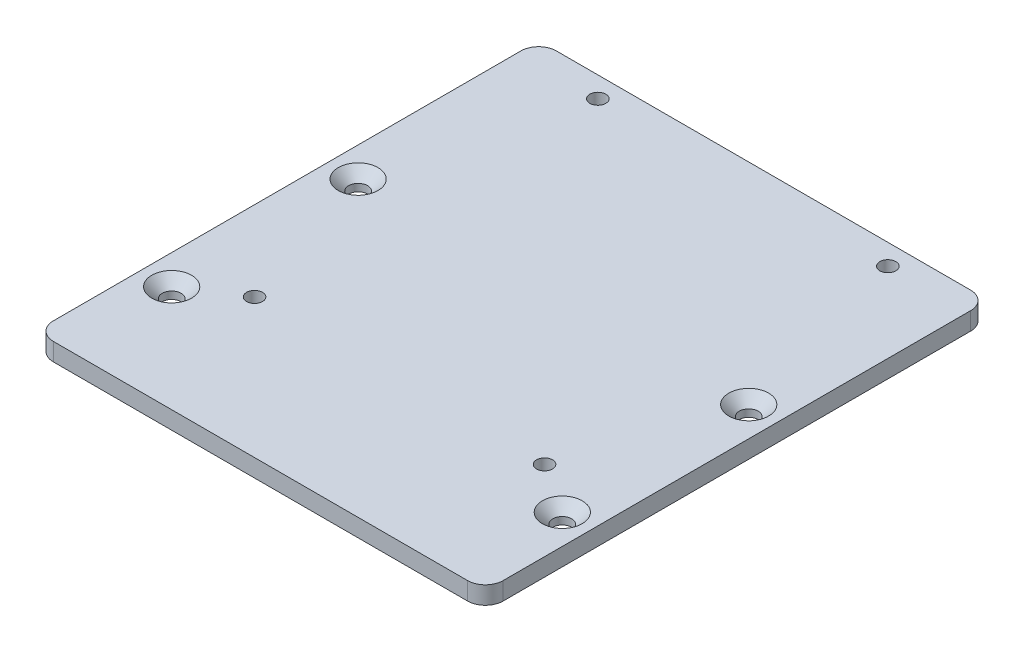
ISO-10303-21;
HEADER;
FILE_DESCRIPTION(('STEP AP214'),'2;1');
FILE_NAME('part.step','',(''),(''),'','','');
FILE_SCHEMA(('AUTOMOTIVE_DESIGN { 1 0 10303 214 1 1 1 1 }'));
ENDSEC;
DATA;
#1=APPLICATION_CONTEXT('core data for automotive mechanical design processes');
#2=APPLICATION_PROTOCOL_DEFINITION('international standard','automotive_design',2000,#1);
#3=PRODUCT_CONTEXT('',#1,'mechanical');
#4=PRODUCT('Part','Part','',(#3));
#5=PRODUCT_RELATED_PRODUCT_CATEGORY('part','',(#4));
#6=PRODUCT_DEFINITION_FORMATION('','',#4);
#7=PRODUCT_DEFINITION_CONTEXT('part definition',#1,'design');
#8=PRODUCT_DEFINITION('design','',#6,#7);
#9=PRODUCT_DEFINITION_SHAPE('','',#8);
#10=(LENGTH_UNIT() NAMED_UNIT(*) SI_UNIT(.MILLI.,.METRE.));
#11=(NAMED_UNIT(*) PLANE_ANGLE_UNIT() SI_UNIT($,.RADIAN.));
#12=(NAMED_UNIT(*) SI_UNIT($,.STERADIAN.) SOLID_ANGLE_UNIT());
#13=UNCERTAINTY_MEASURE_WITH_UNIT(LENGTH_MEASURE(1.E-05),#10,'distance_accuracy_value','');
#14=(GEOMETRIC_REPRESENTATION_CONTEXT(3) GLOBAL_UNCERTAINTY_ASSIGNED_CONTEXT((#13)) GLOBAL_UNIT_ASSIGNED_CONTEXT((#10,
#11,#12)) REPRESENTATION_CONTEXT('',''));
#15=CARTESIAN_POINT('',(0.,0.,0.));
#16=DIRECTION('',(0.,0.,1.));
#17=DIRECTION('',(1.,0.,0.));
#18=AXIS2_PLACEMENT_3D('',#15,#16,#17);
#19=CARTESIAN_POINT('',(-38.,3.,42.5));
#20=DIRECTION('',(1.,0.,0.));
#21=DIRECTION('',(0.,0.,-1.));
#22=AXIS2_PLACEMENT_3D('',#19,#20,#21);
#23=PLANE('',#22);
#24=DIRECTION('',(0.,0.,1.));
#25=VECTOR('',#24,1.);
#26=CARTESIAN_POINT('',(-38.,3.,42.5));
#27=LINE('',#26,#25);
#28=CARTESIAN_POINT('',(-38.,3.,-39.5));
#29=VERTEX_POINT('',#28);
#30=CARTESIAN_POINT('',(-38.,3.,39.5));
#31=VERTEX_POINT('',#30);
#32=EDGE_CURVE('E128',#29,#31,#27,.T.);
#33=ORIENTED_EDGE('',*,*,#32,.F.);
#34=DIRECTION('',(0.,-1.,0.));
#35=VECTOR('',#34,1.);
#36=CARTESIAN_POINT('',(-38.,3.,-39.5));
#37=LINE('',#36,#35);
#38=CARTESIAN_POINT('',(-38.,0.,-39.5));
#39=VERTEX_POINT('',#38);
#40=EDGE_CURVE('E112',#29,#39,#37,.T.);
#41=ORIENTED_EDGE('',*,*,#40,.T.);
#42=DIRECTION('',(0.,0.,1.));
#43=VECTOR('',#42,1.);
#44=CARTESIAN_POINT('',(-38.,0.,42.5));
#45=LINE('',#44,#43);
#46=CARTESIAN_POINT('',(-38.,0.,39.5));
#47=VERTEX_POINT('',#46);
#48=EDGE_CURVE('E125',#39,#47,#45,.T.);
#49=ORIENTED_EDGE('',*,*,#48,.T.);
#50=DIRECTION('',(0.,-1.,0.));
#51=VECTOR('',#50,1.);
#52=CARTESIAN_POINT('',(-38.,3.,39.5));
#53=LINE('',#52,#51);
#54=EDGE_CURVE('E130',#47,#31,#53,.F.);
#55=ORIENTED_EDGE('',*,*,#54,.T.);
#56=EDGE_LOOP('',(#33,#41,#49,#55));
#57=FACE_BOUND('',#56,.T.);
#58=ADVANCED_FACE('F42',(#57),#23,.F.);
#59=CARTESIAN_POINT('',(38.,3.,42.5));
#60=DIRECTION('',(0.,0.,-1.));
#61=DIRECTION('',(-1.,0.,0.));
#62=AXIS2_PLACEMENT_3D('',#59,#60,#61);
#63=PLANE('',#62);
#64=DIRECTION('',(1.,0.,0.));
#65=VECTOR('',#64,1.);
#66=CARTESIAN_POINT('',(38.,0.,42.5));
#67=LINE('',#66,#65);
#68=CARTESIAN_POINT('',(-35.,0.,42.5));
#69=VERTEX_POINT('',#68);
#70=CARTESIAN_POINT('',(35.,0.,42.5));
#71=VERTEX_POINT('',#70);
#72=EDGE_CURVE('E135',#69,#71,#67,.T.);
#73=ORIENTED_EDGE('',*,*,#72,.T.);
#74=DIRECTION('',(0.,-1.,0.));
#75=VECTOR('',#74,1.);
#76=CARTESIAN_POINT('',(35.,3.,42.5));
#77=LINE('',#76,#75);
#78=CARTESIAN_POINT('',(35.,3.,42.5));
#79=VERTEX_POINT('',#78);
#80=EDGE_CURVE('E12',#71,#79,#77,.F.);
#81=ORIENTED_EDGE('',*,*,#80,.T.);
#82=DIRECTION('',(1.,0.,0.));
#83=VECTOR('',#82,1.);
#84=CARTESIAN_POINT('',(38.,3.,42.5));
#85=LINE('',#84,#83);
#86=CARTESIAN_POINT('',(-35.,3.,42.5));
#87=VERTEX_POINT('',#86);
#88=EDGE_CURVE('E188',#87,#79,#85,.T.);
#89=ORIENTED_EDGE('',*,*,#88,.F.);
#90=DIRECTION('',(0.,-1.,0.));
#91=VECTOR('',#90,1.);
#92=CARTESIAN_POINT('',(-35.,3.,42.5));
#93=LINE('',#92,#91);
#94=EDGE_CURVE('E50',#87,#69,#93,.T.);
#95=ORIENTED_EDGE('',*,*,#94,.T.);
#96=EDGE_LOOP('',(#73,#81,#89,#95));
#97=FACE_BOUND('',#96,.T.);
#98=ADVANCED_FACE('F186',(#97),#63,.F.);
#99=CARTESIAN_POINT('',(38.,3.,42.5));
#100=DIRECTION('',(-1.,0.,0.));
#101=DIRECTION('',(0.,0.,1.));
#102=AXIS2_PLACEMENT_3D('',#99,#100,#101);
#103=PLANE('',#102);
#104=DIRECTION('',(0.,0.,-1.));
#105=VECTOR('',#104,1.);
#106=CARTESIAN_POINT('',(38.,0.,42.5));
#107=LINE('',#106,#105);
#108=CARTESIAN_POINT('',(38.,0.,39.5));
#109=VERTEX_POINT('',#108);
#110=CARTESIAN_POINT('',(38.,0.,-39.5));
#111=VERTEX_POINT('',#110);
#112=EDGE_CURVE('E141',#109,#111,#107,.T.);
#113=ORIENTED_EDGE('',*,*,#112,.T.);
#114=DIRECTION('',(0.,-1.,0.));
#115=VECTOR('',#114,1.);
#116=CARTESIAN_POINT('',(38.,3.,-39.5));
#117=LINE('',#116,#115);
#118=CARTESIAN_POINT('',(38.,3.,-39.5));
#119=VERTEX_POINT('',#118);
#120=EDGE_CURVE('E57',#111,#119,#117,.F.);
#121=ORIENTED_EDGE('',*,*,#120,.T.);
#122=DIRECTION('',(0.,0.,-1.));
#123=VECTOR('',#122,1.);
#124=CARTESIAN_POINT('',(38.,3.,42.5));
#125=LINE('',#124,#123);
#126=CARTESIAN_POINT('',(38.,3.,39.5));
#127=VERTEX_POINT('',#126);
#128=EDGE_CURVE('E196',#127,#119,#125,.T.);
#129=ORIENTED_EDGE('',*,*,#128,.F.);
#130=DIRECTION('',(0.,-1.,0.));
#131=VECTOR('',#130,1.);
#132=CARTESIAN_POINT('',(38.,3.,39.5));
#133=LINE('',#132,#131);
#134=EDGE_CURVE('E179',#127,#109,#133,.T.);
#135=ORIENTED_EDGE('',*,*,#134,.T.);
#136=EDGE_LOOP('',(#113,#121,#129,#135));
#137=FACE_BOUND('',#136,.T.);
#138=ADVANCED_FACE('F195',(#137),#103,.F.);
#139=CARTESIAN_POINT('',(38.,3.,-42.5));
#140=DIRECTION('',(0.,0.,1.));
#141=DIRECTION('',(1.,0.,0.));
#142=AXIS2_PLACEMENT_3D('',#139,#140,#141);
#143=PLANE('',#142);
#144=DIRECTION('',(-1.,0.,0.));
#145=VECTOR('',#144,1.);
#146=CARTESIAN_POINT('',(38.,0.,-42.5));
#147=LINE('',#146,#145);
#148=CARTESIAN_POINT('',(35.,0.,-42.5));
#149=VERTEX_POINT('',#148);
#150=CARTESIAN_POINT('',(-35.,0.,-42.5));
#151=VERTEX_POINT('',#150);
#152=EDGE_CURVE('E156',#149,#151,#147,.T.);
#153=ORIENTED_EDGE('',*,*,#152,.T.);
#154=DIRECTION('',(0.,-1.,0.));
#155=VECTOR('',#154,1.);
#156=CARTESIAN_POINT('',(-35.,3.,-42.5));
#157=LINE('',#156,#155);
#158=CARTESIAN_POINT('',(-35.,3.,-42.5));
#159=VERTEX_POINT('',#158);
#160=EDGE_CURVE('E113',#151,#159,#157,.F.);
#161=ORIENTED_EDGE('',*,*,#160,.T.);
#162=DIRECTION('',(-1.,0.,0.));
#163=VECTOR('',#162,1.);
#164=CARTESIAN_POINT('',(38.,3.,-42.5));
#165=LINE('',#164,#163);
#166=CARTESIAN_POINT('',(35.,3.,-42.5));
#167=VERTEX_POINT('',#166);
#168=EDGE_CURVE('E147',#167,#159,#165,.T.);
#169=ORIENTED_EDGE('',*,*,#168,.F.);
#170=DIRECTION('',(0.,-1.,0.));
#171=VECTOR('',#170,1.);
#172=CARTESIAN_POINT('',(35.,3.,-42.5));
#173=LINE('',#172,#171);
#174=EDGE_CURVE('E119',#167,#149,#173,.T.);
#175=ORIENTED_EDGE('',*,*,#174,.T.);
#176=EDGE_LOOP('',(#153,#161,#169,#175));
#177=FACE_BOUND('',#176,.T.);
#178=ADVANCED_FACE('F297',(#177),#143,.F.);
#179=CARTESIAN_POINT('',(0.,3.,0.));
#180=DIRECTION('',(0.,1.,0.));
#181=DIRECTION('',(0.,0.,1.));
#182=AXIS2_PLACEMENT_3D('',#179,#180,#181);
#183=PLANE('',#182);
#184=CARTESIAN_POINT('',(-33.,3.,24.5));
#185=DIRECTION('',(0.,1.,0.));
#186=DIRECTION('',(0.,0.,1.));
#187=AXIS2_PLACEMENT_3D('',#184,#185,#186);
#188=CIRCLE('',#187,3.36);
#189=CARTESIAN_POINT('',(-33.,3.,27.86));
#190=VERTEX_POINT('',#189);
#191=EDGE_CURVE('E535',#190,#190,#188,.T.);
#192=ORIENTED_EDGE('',*,*,#191,.F.);
#193=EDGE_LOOP('',(#192));
#194=FACE_BOUND('',#193,.T.);
#195=CARTESIAN_POINT('',(-33.,3.,-7.));
#196=DIRECTION('',(0.,1.,0.));
#197=DIRECTION('',(0.,0.,1.));
#198=AXIS2_PLACEMENT_3D('',#195,#196,#197);
#199=CIRCLE('',#198,3.36);
#200=CARTESIAN_POINT('',(-33.,3.,-3.64));
#201=VERTEX_POINT('',#200);
#202=EDGE_CURVE('E544',#201,#201,#199,.T.);
#203=ORIENTED_EDGE('',*,*,#202,.F.);
#204=EDGE_LOOP('',(#203));
#205=FACE_BOUND('',#204,.T.);
#206=CARTESIAN_POINT('',(33.,3.,-7.00000000000001));
#207=DIRECTION('',(0.,1.,0.));
#208=DIRECTION('',(0.,0.,1.));
#209=AXIS2_PLACEMENT_3D('',#206,#207,#208);
#210=CIRCLE('',#209,3.36);
#211=CARTESIAN_POINT('',(33.,3.,-3.64000000000001));
#212=VERTEX_POINT('',#211);
#213=EDGE_CURVE('E553',#212,#212,#210,.T.);
#214=ORIENTED_EDGE('',*,*,#213,.F.);
#215=EDGE_LOOP('',(#214));
#216=FACE_BOUND('',#215,.T.);
#217=CARTESIAN_POINT('',(33.,3.,24.5));
#218=DIRECTION('',(0.,1.,0.));
#219=DIRECTION('',(0.,0.,1.));
#220=AXIS2_PLACEMENT_3D('',#217,#218,#219);
#221=CIRCLE('',#220,3.36);
#222=CARTESIAN_POINT('',(33.,3.,27.86));
#223=VERTEX_POINT('',#222);
#224=EDGE_CURVE('E248',#223,#223,#221,.T.);
#225=ORIENTED_EDGE('',*,*,#224,.F.);
#226=EDGE_LOOP('',(#225));
#227=FACE_BOUND('',#226,.T.);
#228=CARTESIAN_POINT('',(-24.5,3.,-39.));
#229=DIRECTION('',(0.,1.,0.));
#230=DIRECTION('',(0.,0.,1.));
#231=AXIS2_PLACEMENT_3D('',#228,#229,#230);
#232=CIRCLE('',#231,1.35);
#233=CARTESIAN_POINT('',(-24.5,3.,-37.65));
#234=VERTEX_POINT('',#233);
#235=EDGE_CURVE('E228',#234,#234,#232,.T.);
#236=ORIENTED_EDGE('',*,*,#235,.F.);
#237=EDGE_LOOP('',(#236));
#238=FACE_BOUND('',#237,.T.);
#239=CARTESIAN_POINT('',(-24.5,3.,19.));
#240=DIRECTION('',(0.,1.,0.));
#241=DIRECTION('',(0.,0.,1.));
#242=AXIS2_PLACEMENT_3D('',#239,#240,#241);
#243=CIRCLE('',#242,1.35);
#244=CARTESIAN_POINT('',(-24.5,3.,20.35));
#245=VERTEX_POINT('',#244);
#246=EDGE_CURVE('E221',#245,#245,#243,.T.);
#247=ORIENTED_EDGE('',*,*,#246,.F.);
#248=EDGE_LOOP('',(#247));
#249=FACE_BOUND('',#248,.T.);
#250=CARTESIAN_POINT('',(24.5,3.,19.));
#251=DIRECTION('',(0.,1.,0.));
#252=DIRECTION('',(0.,0.,1.));
#253=AXIS2_PLACEMENT_3D('',#250,#251,#252);
#254=CIRCLE('',#253,1.35);
#255=CARTESIAN_POINT('',(24.5,3.,20.35));
#256=VERTEX_POINT('',#255);
#257=EDGE_CURVE('E210',#256,#256,#254,.T.);
#258=ORIENTED_EDGE('',*,*,#257,.F.);
#259=EDGE_LOOP('',(#258));
#260=FACE_BOUND('',#259,.T.);
#261=CARTESIAN_POINT('',(24.5,3.,-39.));
#262=DIRECTION('',(0.,1.,0.));
#263=DIRECTION('',(0.,0.,1.));
#264=AXIS2_PLACEMENT_3D('',#261,#262,#263);
#265=CIRCLE('',#264,1.35);
#266=CARTESIAN_POINT('',(24.5,3.,-37.65));
#267=VERTEX_POINT('',#266);
#268=EDGE_CURVE('E143',#267,#267,#265,.T.);
#269=ORIENTED_EDGE('',*,*,#268,.F.);
#270=EDGE_LOOP('',(#269));
#271=FACE_BOUND('',#270,.T.);
#272=ORIENTED_EDGE('',*,*,#168,.T.);
#273=CARTESIAN_POINT('',(-35.,3.,-39.5));
#274=DIRECTION('',(0.,1.,0.));
#275=DIRECTION('',(0.,0.,1.));
#276=AXIS2_PLACEMENT_3D('',#273,#274,#275);
#277=CIRCLE('',#276,3.);
#278=EDGE_CURVE('E177',#159,#29,#277,.T.);
#279=ORIENTED_EDGE('',*,*,#278,.T.);
#280=ORIENTED_EDGE('',*,*,#32,.T.);
#281=CARTESIAN_POINT('',(-35.,3.,39.5));
#282=DIRECTION('',(0.,1.,0.));
#283=DIRECTION('',(0.,0.,1.));
#284=AXIS2_PLACEMENT_3D('',#281,#282,#283);
#285=CIRCLE('',#284,3.);
#286=EDGE_CURVE('E172',#31,#87,#285,.T.);
#287=ORIENTED_EDGE('',*,*,#286,.T.);
#288=ORIENTED_EDGE('',*,*,#88,.T.);
#289=CARTESIAN_POINT('',(35.,3.,39.5));
#290=DIRECTION('',(0.,1.,0.));
#291=DIRECTION('',(0.,0.,1.));
#292=AXIS2_PLACEMENT_3D('',#289,#290,#291);
#293=CIRCLE('',#292,3.);
#294=EDGE_CURVE('E64',#79,#127,#293,.T.);
#295=ORIENTED_EDGE('',*,*,#294,.T.);
#296=ORIENTED_EDGE('',*,*,#128,.T.);
#297=CARTESIAN_POINT('',(35.,3.,-39.5));
#298=DIRECTION('',(0.,1.,0.));
#299=DIRECTION('',(0.,0.,1.));
#300=AXIS2_PLACEMENT_3D('',#297,#298,#299);
#301=CIRCLE('',#300,3.);
#302=EDGE_CURVE('E175',#119,#167,#301,.T.);
#303=ORIENTED_EDGE('',*,*,#302,.T.);
#304=EDGE_LOOP('',(#272,#279,#280,#287,#288,#295,#296,#303));
#305=FACE_BOUND('',#304,.T.);
#306=ADVANCED_FACE('F293',(#194,#205,#216,#227,#238,#249,#260,#271,#305),#183,.T.);
#307=CARTESIAN_POINT('',(0.,0.,0.));
#308=DIRECTION('',(0.,1.,0.));
#309=DIRECTION('',(0.,0.,1.));
#310=AXIS2_PLACEMENT_3D('',#307,#308,#309);
#311=PLANE('',#310);
#312=CARTESIAN_POINT('',(-33.,0.,24.5));
#313=DIRECTION('',(0.,1.,0.));
#314=DIRECTION('',(0.,0.,1.));
#315=AXIS2_PLACEMENT_3D('',#312,#313,#314);
#316=CIRCLE('',#315,1.6);
#317=CARTESIAN_POINT('',(-33.,0.,26.1));
#318=VERTEX_POINT('',#317);
#319=EDGE_CURVE('E537',#318,#318,#316,.T.);
#320=ORIENTED_EDGE('',*,*,#319,.T.);
#321=EDGE_LOOP('',(#320));
#322=FACE_BOUND('',#321,.T.);
#323=CARTESIAN_POINT('',(-33.,0.,-7.));
#324=DIRECTION('',(0.,1.,0.));
#325=DIRECTION('',(0.,0.,1.));
#326=AXIS2_PLACEMENT_3D('',#323,#324,#325);
#327=CIRCLE('',#326,1.6);
#328=CARTESIAN_POINT('',(-33.,0.,-5.4));
#329=VERTEX_POINT('',#328);
#330=EDGE_CURVE('E549',#329,#329,#327,.T.);
#331=ORIENTED_EDGE('',*,*,#330,.T.);
#332=EDGE_LOOP('',(#331));
#333=FACE_BOUND('',#332,.T.);
#334=CARTESIAN_POINT('',(33.,0.,-7.00000000000001));
#335=DIRECTION('',(0.,1.,0.));
#336=DIRECTION('',(0.,0.,1.));
#337=AXIS2_PLACEMENT_3D('',#334,#335,#336);
#338=CIRCLE('',#337,1.6);
#339=CARTESIAN_POINT('',(33.,0.,-5.40000000000001));
#340=VERTEX_POINT('',#339);
#341=EDGE_CURVE('E243',#340,#340,#338,.T.);
#342=ORIENTED_EDGE('',*,*,#341,.T.);
#343=EDGE_LOOP('',(#342));
#344=FACE_BOUND('',#343,.T.);
#345=CARTESIAN_POINT('',(33.,0.,24.5));
#346=DIRECTION('',(0.,1.,0.));
#347=DIRECTION('',(0.,0.,1.));
#348=AXIS2_PLACEMENT_3D('',#345,#346,#347);
#349=CIRCLE('',#348,1.6);
#350=CARTESIAN_POINT('',(33.,0.,26.1));
#351=VERTEX_POINT('',#350);
#352=EDGE_CURVE('E231',#351,#351,#349,.T.);
#353=ORIENTED_EDGE('',*,*,#352,.T.);
#354=EDGE_LOOP('',(#353));
#355=FACE_BOUND('',#354,.T.);
#356=CARTESIAN_POINT('',(-24.5,0.,-39.));
#357=DIRECTION('',(0.,1.,0.));
#358=DIRECTION('',(0.,0.,1.));
#359=AXIS2_PLACEMENT_3D('',#356,#357,#358);
#360=CIRCLE('',#359,1.35);
#361=CARTESIAN_POINT('',(-24.5,0.,-37.65));
#362=VERTEX_POINT('',#361);
#363=EDGE_CURVE('E223',#362,#362,#360,.T.);
#364=ORIENTED_EDGE('',*,*,#363,.T.);
#365=EDGE_LOOP('',(#364));
#366=FACE_BOUND('',#365,.T.);
#367=CARTESIAN_POINT('',(-24.5,0.,19.));
#368=DIRECTION('',(0.,1.,0.));
#369=DIRECTION('',(0.,0.,1.));
#370=AXIS2_PLACEMENT_3D('',#367,#368,#369);
#371=CIRCLE('',#370,1.35);
#372=CARTESIAN_POINT('',(-24.5,0.,20.35));
#373=VERTEX_POINT('',#372);
#374=EDGE_CURVE('E216',#373,#373,#371,.T.);
#375=ORIENTED_EDGE('',*,*,#374,.T.);
#376=EDGE_LOOP('',(#375));
#377=FACE_BOUND('',#376,.T.);
#378=CARTESIAN_POINT('',(24.5,0.,19.));
#379=DIRECTION('',(0.,1.,0.));
#380=DIRECTION('',(0.,0.,1.));
#381=AXIS2_PLACEMENT_3D('',#378,#379,#380);
#382=CIRCLE('',#381,1.35);
#383=CARTESIAN_POINT('',(24.5,0.,20.35));
#384=VERTEX_POINT('',#383);
#385=EDGE_CURVE('E205',#384,#384,#382,.T.);
#386=ORIENTED_EDGE('',*,*,#385,.T.);
#387=EDGE_LOOP('',(#386));
#388=FACE_BOUND('',#387,.T.);
#389=CARTESIAN_POINT('',(24.5,0.,-39.));
#390=DIRECTION('',(0.,1.,0.));
#391=DIRECTION('',(0.,0.,1.));
#392=AXIS2_PLACEMENT_3D('',#389,#390,#391);
#393=CIRCLE('',#392,1.35);
#394=CARTESIAN_POINT('',(24.5,0.,-37.65));
#395=VERTEX_POINT('',#394);
#396=EDGE_CURVE('E136',#395,#395,#393,.T.);
#397=ORIENTED_EDGE('',*,*,#396,.T.);
#398=EDGE_LOOP('',(#397));
#399=FACE_BOUND('',#398,.T.);
#400=ORIENTED_EDGE('',*,*,#48,.F.);
#401=CARTESIAN_POINT('',(-35.,0.,-39.5));
#402=DIRECTION('',(0.,1.,0.));
#403=DIRECTION('',(0.,0.,1.));
#404=AXIS2_PLACEMENT_3D('',#401,#402,#403);
#405=CIRCLE('',#404,3.);
#406=EDGE_CURVE('E108',#39,#151,#405,.F.);
#407=ORIENTED_EDGE('',*,*,#406,.T.);
#408=ORIENTED_EDGE('',*,*,#152,.F.);
#409=CARTESIAN_POINT('',(35.,0.,-39.5));
#410=DIRECTION('',(0.,1.,0.));
#411=DIRECTION('',(0.,0.,1.));
#412=AXIS2_PLACEMENT_3D('',#409,#410,#411);
#413=CIRCLE('',#412,3.);
#414=EDGE_CURVE('E120',#149,#111,#413,.F.);
#415=ORIENTED_EDGE('',*,*,#414,.T.);
#416=ORIENTED_EDGE('',*,*,#112,.F.);
#417=CARTESIAN_POINT('',(35.,0.,39.5));
#418=DIRECTION('',(0.,1.,0.));
#419=DIRECTION('',(0.,0.,1.));
#420=AXIS2_PLACEMENT_3D('',#417,#418,#419);
#421=CIRCLE('',#420,3.);
#422=EDGE_CURVE('E164',#109,#71,#421,.F.);
#423=ORIENTED_EDGE('',*,*,#422,.T.);
#424=ORIENTED_EDGE('',*,*,#72,.F.);
#425=CARTESIAN_POINT('',(-35.,0.,39.5));
#426=DIRECTION('',(0.,1.,0.));
#427=DIRECTION('',(0.,0.,1.));
#428=AXIS2_PLACEMENT_3D('',#425,#426,#427);
#429=CIRCLE('',#428,3.);
#430=EDGE_CURVE('E129',#69,#47,#429,.F.);
#431=ORIENTED_EDGE('',*,*,#430,.T.);
#432=EDGE_LOOP('',(#400,#407,#408,#415,#416,#423,#424,#431));
#433=FACE_BOUND('',#432,.T.);
#434=ADVANCED_FACE('F132',(#322,#333,#344,#355,#366,#377,#388,#399,#433),#311,.F.);
#435=CARTESIAN_POINT('',(24.5,3.,-39.));
#436=DIRECTION('',(0.,1.,0.));
#437=DIRECTION('',(0.,0.,1.));
#438=AXIS2_PLACEMENT_3D('',#435,#436,#437);
#439=CYLINDRICAL_SURFACE('',#438,1.35);
#440=ORIENTED_EDGE('',*,*,#396,.F.);
#441=EDGE_LOOP('',(#440));
#442=FACE_BOUND('',#441,.T.);
#443=ORIENTED_EDGE('',*,*,#268,.T.);
#444=EDGE_LOOP('',(#443));
#445=FACE_BOUND('',#444,.T.);
#446=ADVANCED_FACE('F308',(#442,#445),#439,.F.);
#447=CARTESIAN_POINT('',(24.5,3.,19.));
#448=DIRECTION('',(0.,1.,0.));
#449=DIRECTION('',(0.,0.,1.));
#450=AXIS2_PLACEMENT_3D('',#447,#448,#449);
#451=CYLINDRICAL_SURFACE('',#450,1.35);
#452=ORIENTED_EDGE('',*,*,#385,.F.);
#453=EDGE_LOOP('',(#452));
#454=FACE_BOUND('',#453,.T.);
#455=ORIENTED_EDGE('',*,*,#257,.T.);
#456=EDGE_LOOP('',(#455));
#457=FACE_BOUND('',#456,.T.);
#458=ADVANCED_FACE('F313',(#454,#457),#451,.F.);
#459=CARTESIAN_POINT('',(-24.5,3.,19.));
#460=DIRECTION('',(0.,1.,0.));
#461=DIRECTION('',(0.,0.,1.));
#462=AXIS2_PLACEMENT_3D('',#459,#460,#461);
#463=CYLINDRICAL_SURFACE('',#462,1.35);
#464=ORIENTED_EDGE('',*,*,#374,.F.);
#465=EDGE_LOOP('',(#464));
#466=FACE_BOUND('',#465,.T.);
#467=ORIENTED_EDGE('',*,*,#246,.T.);
#468=EDGE_LOOP('',(#467));
#469=FACE_BOUND('',#468,.T.);
#470=ADVANCED_FACE('F317',(#466,#469),#463,.F.);
#471=CARTESIAN_POINT('',(-24.5,3.,-39.));
#472=DIRECTION('',(0.,1.,0.));
#473=DIRECTION('',(0.,0.,1.));
#474=AXIS2_PLACEMENT_3D('',#471,#472,#473);
#475=CYLINDRICAL_SURFACE('',#474,1.35);
#476=ORIENTED_EDGE('',*,*,#363,.F.);
#477=EDGE_LOOP('',(#476));
#478=FACE_BOUND('',#477,.T.);
#479=ORIENTED_EDGE('',*,*,#235,.T.);
#480=EDGE_LOOP('',(#479));
#481=FACE_BOUND('',#480,.T.);
#482=ADVANCED_FACE('F270',(#478,#481),#475,.F.);
#483=CARTESIAN_POINT('',(33.,3.,24.5));
#484=DIRECTION('',(0.,1.,0.));
#485=DIRECTION('',(0.,0.,1.));
#486=AXIS2_PLACEMENT_3D('',#483,#484,#485);
#487=CYLINDRICAL_SURFACE('',#486,1.6);
#488=ORIENTED_EDGE('',*,*,#352,.F.);
#489=EDGE_LOOP('',(#488));
#490=FACE_BOUND('',#489,.T.);
#491=CARTESIAN_POINT('',(33.,1.24,24.5));
#492=DIRECTION('',(0.,1.,0.));
#493=DIRECTION('',(0.,0.,1.));
#494=AXIS2_PLACEMENT_3D('',#491,#492,#493);
#495=CIRCLE('',#494,1.6);
#496=CARTESIAN_POINT('',(33.,1.24,26.1));
#497=VERTEX_POINT('',#496);
#498=EDGE_CURVE('E236',#497,#497,#495,.T.);
#499=ORIENTED_EDGE('',*,*,#498,.T.);
#500=EDGE_LOOP('',(#499));
#501=FACE_BOUND('',#500,.T.);
#502=ADVANCED_FACE('F257',(#490,#501),#487,.F.);
#503=CARTESIAN_POINT('',(33.,3.,24.5));
#504=DIRECTION('',(0.,1.,0.));
#505=DIRECTION('',(0.,0.,1.));
#506=AXIS2_PLACEMENT_3D('',#503,#504,#505);
#507=CONICAL_SURFACE('',#506,3.36,0.78539816339745);
#508=ORIENTED_EDGE('',*,*,#498,.F.);
#509=EDGE_LOOP('',(#508));
#510=FACE_BOUND('',#509,.T.);
#511=ORIENTED_EDGE('',*,*,#224,.T.);
#512=EDGE_LOOP('',(#511));
#513=FACE_BOUND('',#512,.T.);
#514=ADVANCED_FACE('F259',(#510,#513),#507,.F.);
#515=CARTESIAN_POINT('',(33.,3.,-7.00000000000001));
#516=DIRECTION('',(0.,1.,0.));
#517=DIRECTION('',(0.,0.,1.));
#518=AXIS2_PLACEMENT_3D('',#515,#516,#517);
#519=CYLINDRICAL_SURFACE('',#518,1.6);
#520=ORIENTED_EDGE('',*,*,#341,.F.);
#521=EDGE_LOOP('',(#520));
#522=FACE_BOUND('',#521,.T.);
#523=CARTESIAN_POINT('',(33.,1.24,-7.00000000000001));
#524=DIRECTION('',(0.,1.,0.));
#525=DIRECTION('',(0.,0.,1.));
#526=AXIS2_PLACEMENT_3D('',#523,#524,#525);
#527=CIRCLE('',#526,1.6);
#528=CARTESIAN_POINT('',(33.,1.24,-5.40000000000001));
#529=VERTEX_POINT('',#528);
#530=EDGE_CURVE('E249',#529,#529,#527,.T.);
#531=ORIENTED_EDGE('',*,*,#530,.T.);
#532=EDGE_LOOP('',(#531));
#533=FACE_BOUND('',#532,.T.);
#534=ADVANCED_FACE('F261',(#522,#533),#519,.F.);
#535=CARTESIAN_POINT('',(33.,3.,-7.00000000000001));
#536=DIRECTION('',(0.,1.,0.));
#537=DIRECTION('',(0.,0.,1.));
#538=AXIS2_PLACEMENT_3D('',#535,#536,#537);
#539=CONICAL_SURFACE('',#538,3.36,0.78539816339745);
#540=ORIENTED_EDGE('',*,*,#530,.F.);
#541=EDGE_LOOP('',(#540));
#542=FACE_BOUND('',#541,.T.);
#543=ORIENTED_EDGE('',*,*,#213,.T.);
#544=EDGE_LOOP('',(#543));
#545=FACE_BOUND('',#544,.T.);
#546=ADVANCED_FACE('F267',(#542,#545),#539,.F.);
#547=CARTESIAN_POINT('',(-33.,3.,-7.));
#548=DIRECTION('',(0.,1.,0.));
#549=DIRECTION('',(0.,0.,1.));
#550=AXIS2_PLACEMENT_3D('',#547,#548,#549);
#551=CYLINDRICAL_SURFACE('',#550,1.6);
#552=ORIENTED_EDGE('',*,*,#330,.F.);
#553=EDGE_LOOP('',(#552));
#554=FACE_BOUND('',#553,.T.);
#555=CARTESIAN_POINT('',(-33.,1.24,-7.));
#556=DIRECTION('',(0.,1.,0.));
#557=DIRECTION('',(0.,0.,1.));
#558=AXIS2_PLACEMENT_3D('',#555,#556,#557);
#559=CIRCLE('',#558,1.6);
#560=CARTESIAN_POINT('',(-33.,1.24,-5.4));
#561=VERTEX_POINT('',#560);
#562=EDGE_CURVE('E547',#561,#561,#559,.T.);
#563=ORIENTED_EDGE('',*,*,#562,.T.);
#564=EDGE_LOOP('',(#563));
#565=FACE_BOUND('',#564,.T.);
#566=ADVANCED_FACE('F375',(#554,#565),#551,.F.);
#567=CARTESIAN_POINT('',(-33.,3.,-7.));
#568=DIRECTION('',(0.,1.,0.));
#569=DIRECTION('',(0.,0.,1.));
#570=AXIS2_PLACEMENT_3D('',#567,#568,#569);
#571=CONICAL_SURFACE('',#570,3.36,0.78539816339745);
#572=ORIENTED_EDGE('',*,*,#562,.F.);
#573=EDGE_LOOP('',(#572));
#574=FACE_BOUND('',#573,.T.);
#575=ORIENTED_EDGE('',*,*,#202,.T.);
#576=EDGE_LOOP('',(#575));
#577=FACE_BOUND('',#576,.T.);
#578=ADVANCED_FACE('F386',(#574,#577),#571,.F.);
#579=CARTESIAN_POINT('',(-33.,3.,24.5));
#580=DIRECTION('',(0.,1.,0.));
#581=DIRECTION('',(0.,0.,1.));
#582=AXIS2_PLACEMENT_3D('',#579,#580,#581);
#583=CYLINDRICAL_SURFACE('',#582,1.6);
#584=ORIENTED_EDGE('',*,*,#319,.F.);
#585=EDGE_LOOP('',(#584));
#586=FACE_BOUND('',#585,.T.);
#587=CARTESIAN_POINT('',(-33.,1.24,24.5));
#588=DIRECTION('',(0.,1.,0.));
#589=DIRECTION('',(0.,0.,1.));
#590=AXIS2_PLACEMENT_3D('',#587,#588,#589);
#591=CIRCLE('',#590,1.6);
#592=CARTESIAN_POINT('',(-33.,1.24,26.1));
#593=VERTEX_POINT('',#592);
#594=EDGE_CURVE('E532',#593,#593,#591,.T.);
#595=ORIENTED_EDGE('',*,*,#594,.T.);
#596=EDGE_LOOP('',(#595));
#597=FACE_BOUND('',#596,.T.);
#598=ADVANCED_FACE('F397',(#586,#597),#583,.F.);
#599=CARTESIAN_POINT('',(-33.,3.,24.5));
#600=DIRECTION('',(0.,1.,0.));
#601=DIRECTION('',(0.,0.,1.));
#602=AXIS2_PLACEMENT_3D('',#599,#600,#601);
#603=CONICAL_SURFACE('',#602,3.36,0.78539816339745);
#604=ORIENTED_EDGE('',*,*,#594,.F.);
#605=EDGE_LOOP('',(#604));
#606=FACE_BOUND('',#605,.T.);
#607=ORIENTED_EDGE('',*,*,#191,.T.);
#608=EDGE_LOOP('',(#607));
#609=FACE_BOUND('',#608,.T.);
#610=ADVANCED_FACE('F284',(#606,#609),#603,.F.);
#611=CARTESIAN_POINT('',(-35.,3.,-39.5));
#612=DIRECTION('',(0.,-1.,0.));
#613=DIRECTION('',(0.,0.,-1.));
#614=AXIS2_PLACEMENT_3D('',#611,#612,#613);
#615=CYLINDRICAL_SURFACE('',#614,3.);
#616=ORIENTED_EDGE('',*,*,#278,.F.);
#617=ORIENTED_EDGE('',*,*,#160,.F.);
#618=ORIENTED_EDGE('',*,*,#406,.F.);
#619=ORIENTED_EDGE('',*,*,#40,.F.);
#620=EDGE_LOOP('',(#616,#617,#618,#619));
#621=FACE_BOUND('',#620,.T.);
#622=ADVANCED_FACE('F111',(#621),#615,.T.);
#623=CARTESIAN_POINT('',(35.,3.,-39.5));
#624=DIRECTION('',(0.,-1.,0.));
#625=DIRECTION('',(0.,0.,-1.));
#626=AXIS2_PLACEMENT_3D('',#623,#624,#625);
#627=CYLINDRICAL_SURFACE('',#626,3.);
#628=ORIENTED_EDGE('',*,*,#302,.F.);
#629=ORIENTED_EDGE('',*,*,#120,.F.);
#630=ORIENTED_EDGE('',*,*,#414,.F.);
#631=ORIENTED_EDGE('',*,*,#174,.F.);
#632=EDGE_LOOP('',(#628,#629,#630,#631));
#633=FACE_BOUND('',#632,.T.);
#634=ADVANCED_FACE('F283',(#633),#627,.T.);
#635=CARTESIAN_POINT('',(35.,3.,39.5));
#636=DIRECTION('',(0.,-1.,0.));
#637=DIRECTION('',(0.,0.,-1.));
#638=AXIS2_PLACEMENT_3D('',#635,#636,#637);
#639=CYLINDRICAL_SURFACE('',#638,3.);
#640=ORIENTED_EDGE('',*,*,#294,.F.);
#641=ORIENTED_EDGE('',*,*,#80,.F.);
#642=ORIENTED_EDGE('',*,*,#422,.F.);
#643=ORIENTED_EDGE('',*,*,#134,.F.);
#644=EDGE_LOOP('',(#640,#641,#642,#643));
#645=FACE_BOUND('',#644,.T.);
#646=ADVANCED_FACE('F194',(#645),#639,.T.);
#647=CARTESIAN_POINT('',(-35.,3.,39.5));
#648=DIRECTION('',(0.,-1.,0.));
#649=DIRECTION('',(0.,0.,-1.));
#650=AXIS2_PLACEMENT_3D('',#647,#648,#649);
#651=CYLINDRICAL_SURFACE('',#650,3.);
#652=ORIENTED_EDGE('',*,*,#286,.F.);
#653=ORIENTED_EDGE('',*,*,#54,.F.);
#654=ORIENTED_EDGE('',*,*,#430,.F.);
#655=ORIENTED_EDGE('',*,*,#94,.F.);
#656=EDGE_LOOP('',(#652,#653,#654,#655));
#657=FACE_BOUND('',#656,.T.);
#658=ADVANCED_FACE('F44',(#657),#651,.T.);
#659=CLOSED_SHELL('',(#58,#98,#138,#178,#306,#434,#446,#458,#470,#482,#502,#514,#534,#546,#566,
#578,#598,#610,#622,#634,#646,#658));
#660=MANIFOLD_SOLID_BREP('B2',#659);
#661=ADVANCED_BREP_SHAPE_REPRESENTATION('',(#18,#660),#14);
#662=SHAPE_DEFINITION_REPRESENTATION(#9,#661);
ENDSEC;
END-ISO-10303-21;
